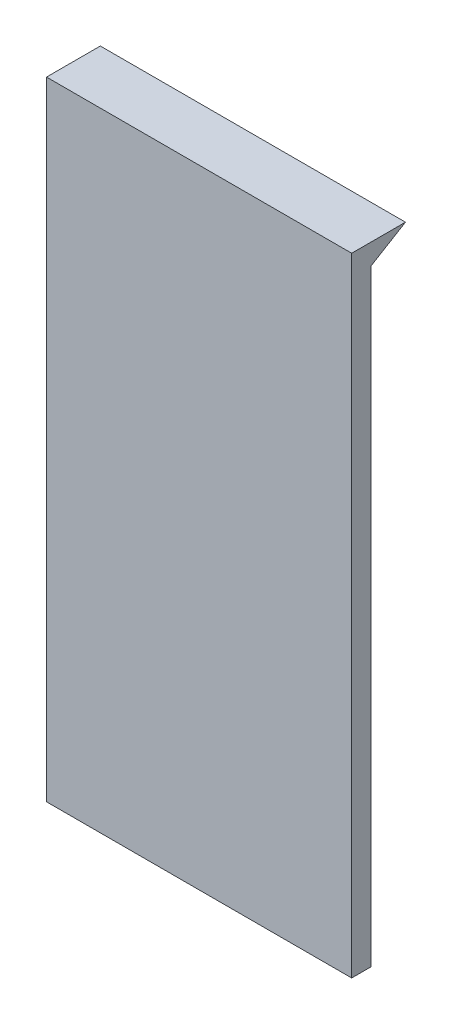
ISO-10303-21;
HEADER;
FILE_DESCRIPTION(('STEP AP214'),'2;1');
FILE_NAME('part.step','',(''),(''),'','','');
FILE_SCHEMA(('AUTOMOTIVE_DESIGN { 1 0 10303 214 1 1 1 1 }'));
ENDSEC;
DATA;
#1=APPLICATION_CONTEXT('core data for automotive mechanical design processes');
#2=APPLICATION_PROTOCOL_DEFINITION('international standard','automotive_design',2000,#1);
#3=PRODUCT_CONTEXT('',#1,'mechanical');
#4=PRODUCT('Part','Part','',(#3));
#5=PRODUCT_RELATED_PRODUCT_CATEGORY('part','',(#4));
#6=PRODUCT_DEFINITION_FORMATION('','',#4);
#7=PRODUCT_DEFINITION_CONTEXT('part definition',#1,'design');
#8=PRODUCT_DEFINITION('design','',#6,#7);
#9=PRODUCT_DEFINITION_SHAPE('','',#8);
#10=(LENGTH_UNIT() NAMED_UNIT(*) SI_UNIT(.MILLI.,.METRE.));
#11=(NAMED_UNIT(*) PLANE_ANGLE_UNIT() SI_UNIT($,.RADIAN.));
#12=(NAMED_UNIT(*) SI_UNIT($,.STERADIAN.) SOLID_ANGLE_UNIT());
#13=UNCERTAINTY_MEASURE_WITH_UNIT(LENGTH_MEASURE(1.E-05),#10,'distance_accuracy_value','');
#14=(GEOMETRIC_REPRESENTATION_CONTEXT(3) GLOBAL_UNCERTAINTY_ASSIGNED_CONTEXT((#13)) GLOBAL_UNIT_ASSIGNED_CONTEXT((#10,
#11,#12)) REPRESENTATION_CONTEXT('',''));
#15=CARTESIAN_POINT('',(0.,0.,0.));
#16=DIRECTION('',(0.,0.,1.));
#17=DIRECTION('',(1.,0.,0.));
#18=AXIS2_PLACEMENT_3D('',#15,#16,#17);
#19=CARTESIAN_POINT('',(0.,0.,-3.));
#20=DIRECTION('',(-1.,0.,0.));
#21=DIRECTION('',(0.,0.,1.));
#22=AXIS2_PLACEMENT_3D('',#19,#20,#21);
#23=PLANE('',#22);
#24=DIRECTION('',(0.,-1.,0.));
#25=VECTOR('',#24,1.);
#26=CARTESIAN_POINT('',(0.,0.,0.));
#27=LINE('',#26,#25);
#28=CARTESIAN_POINT('',(0.,96.675,0.));
#29=VERTEX_POINT('',#28);
#30=CARTESIAN_POINT('',(0.,0.,0.));
#31=VERTEX_POINT('',#30);
#32=EDGE_CURVE('E101',#29,#31,#27,.T.);
#33=ORIENTED_EDGE('',*,*,#32,.F.);
#34=DIRECTION('',(0.,0.,1.));
#35=VECTOR('',#34,1.);
#36=CARTESIAN_POINT('',(0.,96.675,-8.28408735646292));
#37=LINE('',#36,#35);
#38=CARTESIAN_POINT('',(0.,96.675,-8.28408735646292));
#39=VERTEX_POINT('',#38);
#40=EDGE_CURVE('E110',#39,#29,#37,.T.);
#41=ORIENTED_EDGE('',*,*,#40,.F.);
#42=DIRECTION('',(0.,0.515038074910052,-0.857167300702114));
#43=VECTOR('',#42,1.);
#44=CARTESIAN_POINT('',(0.,93.5,-3.));
#45=LINE('',#44,#43);
#46=CARTESIAN_POINT('',(0.,93.5,-3.));
#47=VERTEX_POINT('',#46);
#48=EDGE_CURVE('E113',#47,#39,#45,.T.);
#49=ORIENTED_EDGE('',*,*,#48,.F.);
#50=DIRECTION('',(0.,-1.,0.));
#51=VECTOR('',#50,1.);
#52=CARTESIAN_POINT('',(0.,0.,-3.));
#53=LINE('',#52,#51);
#54=CARTESIAN_POINT('',(0.,0.,-3.));
#55=VERTEX_POINT('',#54);
#56=EDGE_CURVE('E50',#47,#55,#53,.T.);
#57=ORIENTED_EDGE('',*,*,#56,.T.);
#58=DIRECTION('',(0.,0.,1.));
#59=VECTOR('',#58,1.);
#60=CARTESIAN_POINT('',(0.,0.,-3.));
#61=LINE('',#60,#59);
#62=EDGE_CURVE('E37',#55,#31,#61,.T.);
#63=ORIENTED_EDGE('',*,*,#62,.T.);
#64=EDGE_LOOP('',(#33,#41,#49,#57,#63));
#65=FACE_BOUND('',#64,.T.);
#66=ADVANCED_FACE('F34',(#65),#23,.T.);
#67=CARTESIAN_POINT('',(47.,0.,-3.));
#68=DIRECTION('',(1.,0.,0.));
#69=DIRECTION('',(0.,0.,-1.));
#70=AXIS2_PLACEMENT_3D('',#67,#68,#69);
#71=PLANE('',#70);
#72=DIRECTION('',(0.,1.,0.));
#73=VECTOR('',#72,1.);
#74=CARTESIAN_POINT('',(47.,0.,0.));
#75=LINE('',#74,#73);
#76=CARTESIAN_POINT('',(47.,0.,0.));
#77=VERTEX_POINT('',#76);
#78=CARTESIAN_POINT('',(47.,96.675,0.));
#79=VERTEX_POINT('',#78);
#80=EDGE_CURVE('E71',#77,#79,#75,.T.);
#81=ORIENTED_EDGE('',*,*,#80,.F.);
#82=DIRECTION('',(0.,0.,1.));
#83=VECTOR('',#82,1.);
#84=CARTESIAN_POINT('',(47.,0.,-3.));
#85=LINE('',#84,#83);
#86=CARTESIAN_POINT('',(47.,0.,-3.));
#87=VERTEX_POINT('',#86);
#88=EDGE_CURVE('E11',#87,#77,#85,.T.);
#89=ORIENTED_EDGE('',*,*,#88,.F.);
#90=DIRECTION('',(0.,1.,0.));
#91=VECTOR('',#90,1.);
#92=CARTESIAN_POINT('',(47.,0.,-3.));
#93=LINE('',#92,#91);
#94=CARTESIAN_POINT('',(47.,93.5,-3.));
#95=VERTEX_POINT('',#94);
#96=EDGE_CURVE('E85',#87,#95,#93,.T.);
#97=ORIENTED_EDGE('',*,*,#96,.T.);
#98=DIRECTION('',(0.,0.515038074910052,-0.857167300702113));
#99=VECTOR('',#98,1.);
#100=CARTESIAN_POINT('',(47.,93.5,-3.));
#101=LINE('',#100,#99);
#102=CARTESIAN_POINT('',(47.,96.675,-8.28408735646292));
#103=VERTEX_POINT('',#102);
#104=EDGE_CURVE('E123',#95,#103,#101,.T.);
#105=ORIENTED_EDGE('',*,*,#104,.T.);
#106=DIRECTION('',(0.,0.,1.));
#107=VECTOR('',#106,1.);
#108=CARTESIAN_POINT('',(47.,96.675,-8.28408735646292));
#109=LINE('',#108,#107);
#110=EDGE_CURVE('E119',#103,#79,#109,.T.);
#111=ORIENTED_EDGE('',*,*,#110,.T.);
#112=EDGE_LOOP('',(#81,#89,#97,#105,#111));
#113=FACE_BOUND('',#112,.T.);
#114=ADVANCED_FACE('F83',(#113),#71,.T.);
#115=CARTESIAN_POINT('',(0.,0.,-3.));
#116=DIRECTION('',(0.,-1.,0.));
#117=DIRECTION('',(0.,0.,-1.));
#118=AXIS2_PLACEMENT_3D('',#115,#116,#117);
#119=PLANE('',#118);
#120=DIRECTION('',(1.,0.,0.));
#121=VECTOR('',#120,1.);
#122=CARTESIAN_POINT('',(0.,0.,0.));
#123=LINE('',#122,#121);
#124=EDGE_CURVE('E104',#31,#77,#123,.T.);
#125=ORIENTED_EDGE('',*,*,#124,.F.);
#126=ORIENTED_EDGE('',*,*,#62,.F.);
#127=DIRECTION('',(1.,0.,0.));
#128=VECTOR('',#127,1.);
#129=CARTESIAN_POINT('',(0.,0.,-3.));
#130=LINE('',#129,#128);
#131=EDGE_CURVE('E90',#55,#87,#130,.T.);
#132=ORIENTED_EDGE('',*,*,#131,.T.);
#133=ORIENTED_EDGE('',*,*,#88,.T.);
#134=EDGE_LOOP('',(#125,#126,#132,#133));
#135=FACE_BOUND('',#134,.T.);
#136=ADVANCED_FACE('F95',(#135),#119,.T.);
#137=CARTESIAN_POINT('',(0.,0.,-3.));
#138=DIRECTION('',(0.,0.,-1.));
#139=DIRECTION('',(-1.,0.,0.));
#140=AXIS2_PLACEMENT_3D('',#137,#138,#139);
#141=PLANE('',#140);
#142=ORIENTED_EDGE('',*,*,#56,.F.);
#143=DIRECTION('',(-1.,0.,0.));
#144=VECTOR('',#143,1.);
#145=CARTESIAN_POINT('',(0.,93.5,-3.));
#146=LINE('',#145,#144);
#147=EDGE_CURVE('E92',#95,#47,#146,.T.);
#148=ORIENTED_EDGE('',*,*,#147,.F.);
#149=ORIENTED_EDGE('',*,*,#96,.F.);
#150=ORIENTED_EDGE('',*,*,#131,.F.);
#151=EDGE_LOOP('',(#142,#148,#149,#150));
#152=FACE_BOUND('',#151,.T.);
#153=ADVANCED_FACE('F89',(#152),#141,.T.);
#154=CARTESIAN_POINT('',(0.,0.,0.));
#155=DIRECTION('',(0.,0.,-1.));
#156=DIRECTION('',(-1.,0.,0.));
#157=AXIS2_PLACEMENT_3D('',#154,#155,#156);
#158=PLANE('',#157);
#159=ORIENTED_EDGE('',*,*,#32,.T.);
#160=ORIENTED_EDGE('',*,*,#124,.T.);
#161=ORIENTED_EDGE('',*,*,#80,.T.);
#162=DIRECTION('',(1.,0.,0.));
#163=VECTOR('',#162,1.);
#164=CARTESIAN_POINT('',(-8.87168125720873,96.675,0.));
#165=LINE('',#164,#163);
#166=EDGE_CURVE('E105',#29,#79,#165,.T.);
#167=ORIENTED_EDGE('',*,*,#166,.F.);
#168=EDGE_LOOP('',(#159,#160,#161,#167));
#169=FACE_BOUND('',#168,.T.);
#170=ADVANCED_FACE('F107',(#169),#158,.F.);
#171=CARTESIAN_POINT('',(-8.87168125720873,93.5,-3.));
#172=DIRECTION('',(0.,-0.857167300702114,-0.515038074910052));
#173=DIRECTION('',(0.,0.515038074910052,-0.857167300702114));
#174=AXIS2_PLACEMENT_3D('',#171,#172,#173);
#175=PLANE('',#174);
#176=ORIENTED_EDGE('',*,*,#147,.T.);
#177=ORIENTED_EDGE('',*,*,#48,.T.);
#178=DIRECTION('',(1.,0.,0.));
#179=VECTOR('',#178,1.);
#180=CARTESIAN_POINT('',(-8.87168125720873,96.675,-8.28408735646292));
#181=LINE('',#180,#179);
#182=EDGE_CURVE('E115',#39,#103,#181,.T.);
#183=ORIENTED_EDGE('',*,*,#182,.T.);
#184=ORIENTED_EDGE('',*,*,#104,.F.);
#185=EDGE_LOOP('',(#176,#177,#183,#184));
#186=FACE_BOUND('',#185,.T.);
#187=ADVANCED_FACE('F121',(#186),#175,.T.);
#188=CARTESIAN_POINT('',(-8.87168125720873,96.675,-8.28408735646292));
#189=DIRECTION('',(0.,1.,0.));
#190=DIRECTION('',(0.,0.,1.));
#191=AXIS2_PLACEMENT_3D('',#188,#189,#190);
#192=PLANE('',#191);
#193=ORIENTED_EDGE('',*,*,#182,.F.);
#194=ORIENTED_EDGE('',*,*,#40,.T.);
#195=ORIENTED_EDGE('',*,*,#166,.T.);
#196=ORIENTED_EDGE('',*,*,#110,.F.);
#197=EDGE_LOOP('',(#193,#194,#195,#196));
#198=FACE_BOUND('',#197,.T.);
#199=ADVANCED_FACE('F118',(#198),#192,.T.);
#200=CLOSED_SHELL('',(#66,#114,#136,#153,#170,#187,#199));
#201=MANIFOLD_SOLID_BREP('B2',#200);
#202=ADVANCED_BREP_SHAPE_REPRESENTATION('',(#18,#201),#14);
#203=SHAPE_DEFINITION_REPRESENTATION(#9,#202);
ENDSEC;
END-ISO-10303-21;
